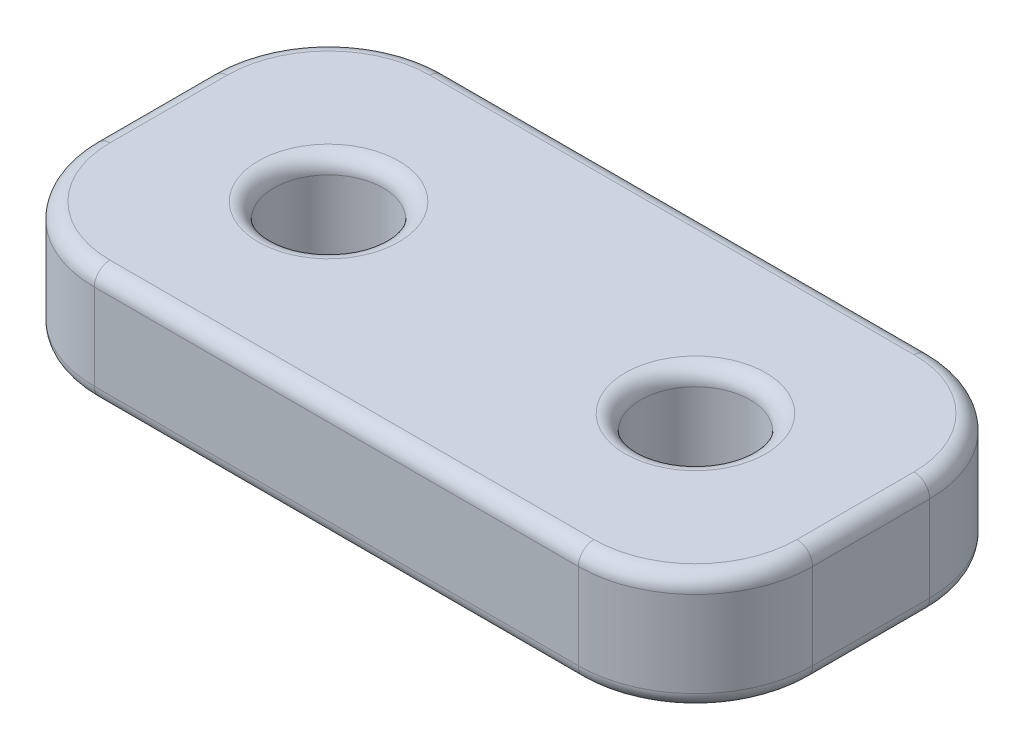
ISO-10303-21;
HEADER;
FILE_DESCRIPTION(('STEP AP214'),'2;1');
FILE_NAME('part.step','',(''),(''),'','','');
FILE_SCHEMA(('AUTOMOTIVE_DESIGN { 1 0 10303 214 1 1 1 1 }'));
ENDSEC;
DATA;
#1=APPLICATION_CONTEXT('core data for automotive mechanical design processes');
#2=APPLICATION_PROTOCOL_DEFINITION('international standard','automotive_design',2000,#1);
#3=PRODUCT_CONTEXT('',#1,'mechanical');
#4=PRODUCT('Part','Part','',(#3));
#5=PRODUCT_RELATED_PRODUCT_CATEGORY('part','',(#4));
#6=PRODUCT_DEFINITION_FORMATION('','',#4);
#7=PRODUCT_DEFINITION_CONTEXT('part definition',#1,'design');
#8=PRODUCT_DEFINITION('design','',#6,#7);
#9=PRODUCT_DEFINITION_SHAPE('','',#8);
#10=(LENGTH_UNIT() NAMED_UNIT(*) SI_UNIT(.MILLI.,.METRE.));
#11=(NAMED_UNIT(*) PLANE_ANGLE_UNIT() SI_UNIT($,.RADIAN.));
#12=(NAMED_UNIT(*) SI_UNIT($,.STERADIAN.) SOLID_ANGLE_UNIT());
#13=UNCERTAINTY_MEASURE_WITH_UNIT(LENGTH_MEASURE(1.E-05),#10,'distance_accuracy_value','');
#14=(GEOMETRIC_REPRESENTATION_CONTEXT(3) GLOBAL_UNCERTAINTY_ASSIGNED_CONTEXT((#13)) GLOBAL_UNIT_ASSIGNED_CONTEXT((#10,
#11,#12)) REPRESENTATION_CONTEXT('',''));
#15=CARTESIAN_POINT('',(0.,0.,0.));
#16=DIRECTION('',(0.,0.,1.));
#17=DIRECTION('',(1.,0.,0.));
#18=AXIS2_PLACEMENT_3D('',#15,#16,#17);
#19=CARTESIAN_POINT('',(0.,3.,0.));
#20=DIRECTION('',(0.,1.,0.));
#21=DIRECTION('',(0.,0.,1.));
#22=AXIS2_PLACEMENT_3D('',#19,#20,#21);
#23=PLANE('',#22);
#24=CARTESIAN_POINT('',(13.9,3.,4.5));
#25=DIRECTION('',(0.,1.,0.));
#26=DIRECTION('',(0.,0.,1.));
#27=AXIS2_PLACEMENT_3D('',#24,#25,#26);
#28=CIRCLE('',#27,1.8);
#29=CARTESIAN_POINT('',(13.9,3.,6.3));
#30=VERTEX_POINT('',#29);
#31=EDGE_CURVE('E11',#30,#30,#28,.F.);
#32=ORIENTED_EDGE('',*,*,#31,.T.);
#33=EDGE_LOOP('',(#32));
#34=FACE_BOUND('',#33,.T.);
#35=DIRECTION('',(1.,0.,0.));
#36=VECTOR('',#35,1.);
#37=CARTESIAN_POINT('',(15.4,3.,8.6));
#38=LINE('',#37,#36);
#39=CARTESIAN_POINT('',(3.,3.,8.6));
#40=VERTEX_POINT('',#39);
#41=CARTESIAN_POINT('',(15.4,3.,8.6));
#42=VERTEX_POINT('',#41);
#43=EDGE_CURVE('E50',#40,#42,#38,.T.);
#44=ORIENTED_EDGE('',*,*,#43,.T.);
#45=CARTESIAN_POINT('',(15.4,3.,6.));
#46=DIRECTION('',(0.,1.,0.));
#47=DIRECTION('',(0.,0.,1.));
#48=AXIS2_PLACEMENT_3D('',#45,#46,#47);
#49=CIRCLE('',#48,2.6);
#50=CARTESIAN_POINT('',(18.,3.,6.));
#51=VERTEX_POINT('',#50);
#52=EDGE_CURVE('E42',#42,#51,#49,.T.);
#53=ORIENTED_EDGE('',*,*,#52,.T.);
#54=DIRECTION('',(0.,0.,-1.));
#55=VECTOR('',#54,1.);
#56=CARTESIAN_POINT('',(18.,3.,3.));
#57=LINE('',#56,#55);
#58=CARTESIAN_POINT('',(18.,3.,3.));
#59=VERTEX_POINT('',#58);
#60=EDGE_CURVE('E232',#51,#59,#57,.T.);
#61=ORIENTED_EDGE('',*,*,#60,.T.);
#62=CARTESIAN_POINT('',(15.4,3.,3.));
#63=DIRECTION('',(0.,1.,0.));
#64=DIRECTION('',(0.,0.,1.));
#65=AXIS2_PLACEMENT_3D('',#62,#63,#64);
#66=CIRCLE('',#65,2.6);
#67=CARTESIAN_POINT('',(15.4,3.,0.4));
#68=VERTEX_POINT('',#67);
#69=EDGE_CURVE('E234',#59,#68,#66,.T.);
#70=ORIENTED_EDGE('',*,*,#69,.T.);
#71=DIRECTION('',(-1.,0.,0.));
#72=VECTOR('',#71,1.);
#73=CARTESIAN_POINT('',(3.,3.,0.4));
#74=LINE('',#73,#72);
#75=CARTESIAN_POINT('',(3.,3.,0.4));
#76=VERTEX_POINT('',#75);
#77=EDGE_CURVE('E236',#68,#76,#74,.T.);
#78=ORIENTED_EDGE('',*,*,#77,.T.);
#79=CARTESIAN_POINT('',(3.,3.,3.));
#80=DIRECTION('',(0.,1.,0.));
#81=DIRECTION('',(0.,0.,1.));
#82=AXIS2_PLACEMENT_3D('',#79,#80,#81);
#83=CIRCLE('',#82,2.6);
#84=CARTESIAN_POINT('',(0.4,3.,3.));
#85=VERTEX_POINT('',#84);
#86=EDGE_CURVE('E238',#76,#85,#83,.T.);
#87=ORIENTED_EDGE('',*,*,#86,.T.);
#88=DIRECTION('',(0.,0.,1.));
#89=VECTOR('',#88,1.);
#90=CARTESIAN_POINT('',(0.4,3.,6.));
#91=LINE('',#90,#89);
#92=CARTESIAN_POINT('',(0.4,3.,6.));
#93=VERTEX_POINT('',#92);
#94=EDGE_CURVE('E240',#85,#93,#91,.T.);
#95=ORIENTED_EDGE('',*,*,#94,.T.);
#96=CARTESIAN_POINT('',(3.,3.,6.));
#97=DIRECTION('',(0.,1.,0.));
#98=DIRECTION('',(0.,0.,1.));
#99=AXIS2_PLACEMENT_3D('',#96,#97,#98);
#100=CIRCLE('',#99,2.6);
#101=EDGE_CURVE('E55',#93,#40,#100,.T.);
#102=ORIENTED_EDGE('',*,*,#101,.T.);
#103=EDGE_LOOP('',(#44,#53,#61,#70,#78,#87,#95,#102));
#104=FACE_BOUND('',#103,.T.);
#105=CARTESIAN_POINT('',(4.5,3.,4.5));
#106=DIRECTION('',(0.,1.,0.));
#107=DIRECTION('',(0.,0.,1.));
#108=AXIS2_PLACEMENT_3D('',#105,#106,#107);
#109=CIRCLE('',#108,1.8);
#110=CARTESIAN_POINT('',(4.5,3.,6.3));
#111=VERTEX_POINT('',#110);
#112=EDGE_CURVE('E229',#111,#111,#109,.F.);
#113=ORIENTED_EDGE('',*,*,#112,.T.);
#114=EDGE_LOOP('',(#113));
#115=FACE_BOUND('',#114,.T.);
#116=ADVANCED_FACE('F33',(#34,#104,#115),#23,.T.);
#117=CARTESIAN_POINT('',(0.,0.,0.));
#118=DIRECTION('',(0.,1.,0.));
#119=DIRECTION('',(0.,0.,1.));
#120=AXIS2_PLACEMENT_3D('',#117,#118,#119);
#121=PLANE('',#120);
#122=CARTESIAN_POINT('',(13.9,0.,4.5));
#123=DIRECTION('',(0.,1.,0.));
#124=DIRECTION('',(0.,0.,1.));
#125=AXIS2_PLACEMENT_3D('',#122,#123,#124);
#126=CIRCLE('',#125,1.8);
#127=CARTESIAN_POINT('',(13.9,0.,6.3));
#128=VERTEX_POINT('',#127);
#129=EDGE_CURVE('E177',#128,#128,#126,.T.);
#130=ORIENTED_EDGE('',*,*,#129,.T.);
#131=EDGE_LOOP('',(#130));
#132=FACE_BOUND('',#131,.T.);
#133=CARTESIAN_POINT('',(4.5,0.,4.5));
#134=DIRECTION('',(0.,1.,0.));
#135=DIRECTION('',(0.,0.,1.));
#136=AXIS2_PLACEMENT_3D('',#133,#134,#135);
#137=CIRCLE('',#136,1.8);
#138=CARTESIAN_POINT('',(4.5,0.,6.3));
#139=VERTEX_POINT('',#138);
#140=EDGE_CURVE('E174',#139,#139,#137,.T.);
#141=ORIENTED_EDGE('',*,*,#140,.T.);
#142=EDGE_LOOP('',(#141));
#143=FACE_BOUND('',#142,.T.);
#144=DIRECTION('',(0.,0.,1.));
#145=VECTOR('',#144,1.);
#146=CARTESIAN_POINT('',(0.4,0.,0.));
#147=LINE('',#146,#145);
#148=CARTESIAN_POINT('',(0.4,0.,6.));
#149=VERTEX_POINT('',#148);
#150=CARTESIAN_POINT('',(0.4,0.,3.));
#151=VERTEX_POINT('',#150);
#152=EDGE_CURVE('E172',#149,#151,#147,.F.);
#153=ORIENTED_EDGE('',*,*,#152,.T.);
#154=CARTESIAN_POINT('',(3.,0.,3.));
#155=DIRECTION('',(0.,1.,0.));
#156=DIRECTION('',(0.,0.,1.));
#157=AXIS2_PLACEMENT_3D('',#154,#155,#156);
#158=CIRCLE('',#157,2.6);
#159=CARTESIAN_POINT('',(3.,0.,0.4));
#160=VERTEX_POINT('',#159);
#161=EDGE_CURVE('E153',#151,#160,#158,.F.);
#162=ORIENTED_EDGE('',*,*,#161,.T.);
#163=DIRECTION('',(-1.,0.,0.));
#164=VECTOR('',#163,1.);
#165=CARTESIAN_POINT('',(0.,0.,0.4));
#166=LINE('',#165,#164);
#167=CARTESIAN_POINT('',(15.4,0.,0.4));
#168=VERTEX_POINT('',#167);
#169=EDGE_CURVE('E161',#160,#168,#166,.F.);
#170=ORIENTED_EDGE('',*,*,#169,.T.);
#171=CARTESIAN_POINT('',(15.4,0.,3.));
#172=DIRECTION('',(0.,1.,0.));
#173=DIRECTION('',(0.,0.,1.));
#174=AXIS2_PLACEMENT_3D('',#171,#172,#173);
#175=CIRCLE('',#174,2.6);
#176=CARTESIAN_POINT('',(18.,0.,3.));
#177=VERTEX_POINT('',#176);
#178=EDGE_CURVE('E167',#168,#177,#175,.F.);
#179=ORIENTED_EDGE('',*,*,#178,.T.);
#180=DIRECTION('',(0.,0.,-1.));
#181=VECTOR('',#180,1.);
#182=CARTESIAN_POINT('',(18.,0.,0.));
#183=LINE('',#182,#181);
#184=CARTESIAN_POINT('',(18.,0.,6.));
#185=VERTEX_POINT('',#184);
#186=EDGE_CURVE('E326',#177,#185,#183,.F.);
#187=ORIENTED_EDGE('',*,*,#186,.T.);
#188=CARTESIAN_POINT('',(15.4,0.,6.));
#189=DIRECTION('',(0.,1.,0.));
#190=DIRECTION('',(0.,0.,1.));
#191=AXIS2_PLACEMENT_3D('',#188,#189,#190);
#192=CIRCLE('',#191,2.6);
#193=CARTESIAN_POINT('',(15.4,0.,8.6));
#194=VERTEX_POINT('',#193);
#195=EDGE_CURVE('E328',#185,#194,#192,.F.);
#196=ORIENTED_EDGE('',*,*,#195,.T.);
#197=DIRECTION('',(1.,0.,0.));
#198=VECTOR('',#197,1.);
#199=CARTESIAN_POINT('',(0.,0.,8.6));
#200=LINE('',#199,#198);
#201=CARTESIAN_POINT('',(3.,0.,8.6));
#202=VERTEX_POINT('',#201);
#203=EDGE_CURVE('E330',#194,#202,#200,.F.);
#204=ORIENTED_EDGE('',*,*,#203,.T.);
#205=CARTESIAN_POINT('',(3.,0.,6.));
#206=DIRECTION('',(0.,1.,0.));
#207=DIRECTION('',(0.,0.,1.));
#208=AXIS2_PLACEMENT_3D('',#205,#206,#207);
#209=CIRCLE('',#208,2.6);
#210=EDGE_CURVE('E179',#202,#149,#209,.F.);
#211=ORIENTED_EDGE('',*,*,#210,.T.);
#212=EDGE_LOOP('',(#153,#162,#170,#179,#187,#196,#204,#211));
#213=FACE_BOUND('',#212,.T.);
#214=ADVANCED_FACE('F170',(#132,#143,#213),#121,.F.);
#215=CARTESIAN_POINT('',(0.,3.,0.));
#216=DIRECTION('',(1.,0.,0.));
#217=DIRECTION('',(0.,0.,-1.));
#218=AXIS2_PLACEMENT_3D('',#215,#216,#217);
#219=PLANE('',#218);
#220=DIRECTION('',(0.,-1.,0.));
#221=VECTOR('',#220,1.);
#222=CARTESIAN_POINT('',(0.,3.,3.));
#223=LINE('',#222,#221);
#224=CARTESIAN_POINT('',(0.,2.6,3.));
#225=VERTEX_POINT('',#224);
#226=CARTESIAN_POINT('',(0.,0.4,3.));
#227=VERTEX_POINT('',#226);
#228=EDGE_CURVE('E301',#225,#227,#223,.T.);
#229=ORIENTED_EDGE('',*,*,#228,.T.);
#230=DIRECTION('',(0.,0.,1.));
#231=VECTOR('',#230,1.);
#232=CARTESIAN_POINT('',(0.,0.4,0.));
#233=LINE('',#232,#231);
#234=CARTESIAN_POINT('',(0.,0.4,6.));
#235=VERTEX_POINT('',#234);
#236=EDGE_CURVE('E202',#227,#235,#233,.T.);
#237=ORIENTED_EDGE('',*,*,#236,.T.);
#238=DIRECTION('',(0.,-1.,0.));
#239=VECTOR('',#238,1.);
#240=CARTESIAN_POINT('',(0.,3.,6.));
#241=LINE('',#240,#239);
#242=CARTESIAN_POINT('',(0.,2.6,6.));
#243=VERTEX_POINT('',#242);
#244=EDGE_CURVE('E168',#235,#243,#241,.F.);
#245=ORIENTED_EDGE('',*,*,#244,.T.);
#246=DIRECTION('',(0.,0.,1.));
#247=VECTOR('',#246,1.);
#248=CARTESIAN_POINT('',(0.,2.6,3.));
#249=LINE('',#248,#247);
#250=EDGE_CURVE('E200',#243,#225,#249,.F.);
#251=ORIENTED_EDGE('',*,*,#250,.T.);
#252=EDGE_LOOP('',(#229,#237,#245,#251));
#253=FACE_BOUND('',#252,.T.);
#254=ADVANCED_FACE('F343',(#253),#219,.F.);
#255=CARTESIAN_POINT('',(0.,3.,9.));
#256=DIRECTION('',(0.,0.,-1.));
#257=DIRECTION('',(-1.,0.,0.));
#258=AXIS2_PLACEMENT_3D('',#255,#256,#257);
#259=PLANE('',#258);
#260=DIRECTION('',(0.,-1.,0.));
#261=VECTOR('',#260,1.);
#262=CARTESIAN_POINT('',(3.,3.,9.));
#263=LINE('',#262,#261);
#264=CARTESIAN_POINT('',(3.,2.6,9.));
#265=VERTEX_POINT('',#264);
#266=CARTESIAN_POINT('',(3.,0.4,9.));
#267=VERTEX_POINT('',#266);
#268=EDGE_CURVE('E316',#265,#267,#263,.T.);
#269=ORIENTED_EDGE('',*,*,#268,.T.);
#270=DIRECTION('',(1.,0.,0.));
#271=VECTOR('',#270,1.);
#272=CARTESIAN_POINT('',(0.,0.4,9.));
#273=LINE('',#272,#271);
#274=CARTESIAN_POINT('',(15.4,0.4,9.));
#275=VERTEX_POINT('',#274);
#276=EDGE_CURVE('E210',#267,#275,#273,.T.);
#277=ORIENTED_EDGE('',*,*,#276,.T.);
#278=DIRECTION('',(0.,-1.,0.));
#279=VECTOR('',#278,1.);
#280=CARTESIAN_POINT('',(15.4,3.,9.));
#281=LINE('',#280,#279);
#282=CARTESIAN_POINT('',(15.4,2.6,9.));
#283=VERTEX_POINT('',#282);
#284=EDGE_CURVE('E319',#275,#283,#281,.F.);
#285=ORIENTED_EDGE('',*,*,#284,.T.);
#286=DIRECTION('',(1.,0.,0.));
#287=VECTOR('',#286,1.);
#288=CARTESIAN_POINT('',(3.,2.6,9.));
#289=LINE('',#288,#287);
#290=EDGE_CURVE('E208',#283,#265,#289,.F.);
#291=ORIENTED_EDGE('',*,*,#290,.T.);
#292=EDGE_LOOP('',(#269,#277,#285,#291));
#293=FACE_BOUND('',#292,.T.);
#294=ADVANCED_FACE('F387',(#293),#259,.F.);
#295=CARTESIAN_POINT('',(18.4,3.,0.));
#296=DIRECTION('',(-1.,0.,0.));
#297=DIRECTION('',(0.,0.,1.));
#298=AXIS2_PLACEMENT_3D('',#295,#296,#297);
#299=PLANE('',#298);
#300=DIRECTION('',(0.,-1.,0.));
#301=VECTOR('',#300,1.);
#302=CARTESIAN_POINT('',(18.4,3.,6.));
#303=LINE('',#302,#301);
#304=CARTESIAN_POINT('',(18.4,2.6,6.));
#305=VERTEX_POINT('',#304);
#306=CARTESIAN_POINT('',(18.4,0.4,6.));
#307=VERTEX_POINT('',#306);
#308=EDGE_CURVE('E308',#305,#307,#303,.T.);
#309=ORIENTED_EDGE('',*,*,#308,.T.);
#310=DIRECTION('',(0.,0.,-1.));
#311=VECTOR('',#310,1.);
#312=CARTESIAN_POINT('',(18.4,0.4,0.));
#313=LINE('',#312,#311);
#314=CARTESIAN_POINT('',(18.4,0.4,3.));
#315=VERTEX_POINT('',#314);
#316=EDGE_CURVE('E219',#307,#315,#313,.T.);
#317=ORIENTED_EDGE('',*,*,#316,.T.);
#318=DIRECTION('',(0.,-1.,0.));
#319=VECTOR('',#318,1.);
#320=CARTESIAN_POINT('',(18.4,3.,3.));
#321=LINE('',#320,#319);
#322=CARTESIAN_POINT('',(18.4,2.6,3.));
#323=VERTEX_POINT('',#322);
#324=EDGE_CURVE('E313',#315,#323,#321,.F.);
#325=ORIENTED_EDGE('',*,*,#324,.T.);
#326=DIRECTION('',(0.,0.,-1.));
#327=VECTOR('',#326,1.);
#328=CARTESIAN_POINT('',(18.4,2.6,6.));
#329=LINE('',#328,#327);
#330=EDGE_CURVE('E217',#323,#305,#329,.F.);
#331=ORIENTED_EDGE('',*,*,#330,.T.);
#332=EDGE_LOOP('',(#309,#317,#325,#331));
#333=FACE_BOUND('',#332,.T.);
#334=ADVANCED_FACE('F371',(#333),#299,.F.);
#335=CARTESIAN_POINT('',(0.,3.,0.));
#336=DIRECTION('',(0.,0.,1.));
#337=DIRECTION('',(1.,0.,0.));
#338=AXIS2_PLACEMENT_3D('',#335,#336,#337);
#339=PLANE('',#338);
#340=DIRECTION('',(0.,-1.,0.));
#341=VECTOR('',#340,1.);
#342=CARTESIAN_POINT('',(15.4,3.,0.));
#343=LINE('',#342,#341);
#344=CARTESIAN_POINT('',(15.4,2.6,0.));
#345=VERTEX_POINT('',#344);
#346=CARTESIAN_POINT('',(15.4,0.4,0.));
#347=VERTEX_POINT('',#346);
#348=EDGE_CURVE('E306',#345,#347,#343,.T.);
#349=ORIENTED_EDGE('',*,*,#348,.T.);
#350=DIRECTION('',(-1.,0.,0.));
#351=VECTOR('',#350,1.);
#352=CARTESIAN_POINT('',(0.,0.4,0.));
#353=LINE('',#352,#351);
#354=CARTESIAN_POINT('',(3.,0.4,0.));
#355=VERTEX_POINT('',#354);
#356=EDGE_CURVE('E227',#347,#355,#353,.T.);
#357=ORIENTED_EDGE('',*,*,#356,.T.);
#358=DIRECTION('',(0.,-1.,0.));
#359=VECTOR('',#358,1.);
#360=CARTESIAN_POINT('',(3.,3.,0.));
#361=LINE('',#360,#359);
#362=CARTESIAN_POINT('',(3.,2.6,0.));
#363=VERTEX_POINT('',#362);
#364=EDGE_CURVE('E262',#355,#363,#361,.F.);
#365=ORIENTED_EDGE('',*,*,#364,.T.);
#366=DIRECTION('',(-1.,0.,0.));
#367=VECTOR('',#366,1.);
#368=CARTESIAN_POINT('',(15.4,2.6,0.));
#369=LINE('',#368,#367);
#370=EDGE_CURVE('E225',#363,#345,#369,.F.);
#371=ORIENTED_EDGE('',*,*,#370,.T.);
#372=EDGE_LOOP('',(#349,#357,#365,#371));
#373=FACE_BOUND('',#372,.T.);
#374=ADVANCED_FACE('F304',(#373),#339,.F.);
#375=CARTESIAN_POINT('',(4.5,3.,4.5));
#376=DIRECTION('',(0.,-1.,0.));
#377=DIRECTION('',(0.,0.,-1.));
#378=AXIS2_PLACEMENT_3D('',#375,#376,#377);
#379=CYLINDRICAL_SURFACE('',#378,1.4);
#380=CARTESIAN_POINT('',(4.5,0.4,4.5));
#381=DIRECTION('',(0.,1.,0.));
#382=DIRECTION('',(0.,0.,1.));
#383=AXIS2_PLACEMENT_3D('',#380,#381,#382);
#384=CIRCLE('',#383,1.4);
#385=CARTESIAN_POINT('',(4.5,0.4,5.9));
#386=VERTEX_POINT('',#385);
#387=EDGE_CURVE('E194',#386,#386,#384,.F.);
#388=ORIENTED_EDGE('',*,*,#387,.T.);
#389=EDGE_LOOP('',(#388));
#390=FACE_BOUND('',#389,.T.);
#391=CARTESIAN_POINT('',(4.5,2.6,4.5));
#392=DIRECTION('',(0.,1.,0.));
#393=DIRECTION('',(0.,0.,1.));
#394=AXIS2_PLACEMENT_3D('',#391,#392,#393);
#395=CIRCLE('',#394,1.4);
#396=CARTESIAN_POINT('',(4.5,2.6,5.9));
#397=VERTEX_POINT('',#396);
#398=EDGE_CURVE('E191',#397,#397,#395,.T.);
#399=ORIENTED_EDGE('',*,*,#398,.T.);
#400=EDGE_LOOP('',(#399));
#401=FACE_BOUND('',#400,.T.);
#402=ADVANCED_FACE('F405',(#390,#401),#379,.F.);
#403=CARTESIAN_POINT('',(13.9,3.,4.5));
#404=DIRECTION('',(0.,-1.,0.));
#405=DIRECTION('',(0.,0.,-1.));
#406=AXIS2_PLACEMENT_3D('',#403,#404,#405);
#407=CYLINDRICAL_SURFACE('',#406,1.4);
#408=CARTESIAN_POINT('',(13.9,0.4,4.5));
#409=DIRECTION('',(0.,1.,0.));
#410=DIRECTION('',(0.,0.,1.));
#411=AXIS2_PLACEMENT_3D('',#408,#409,#410);
#412=CIRCLE('',#411,1.4);
#413=CARTESIAN_POINT('',(13.9,0.4,5.9));
#414=VERTEX_POINT('',#413);
#415=EDGE_CURVE('E188',#414,#414,#412,.F.);
#416=ORIENTED_EDGE('',*,*,#415,.T.);
#417=EDGE_LOOP('',(#416));
#418=FACE_BOUND('',#417,.T.);
#419=CARTESIAN_POINT('',(13.9,2.6,4.5));
#420=DIRECTION('',(0.,1.,0.));
#421=DIRECTION('',(0.,0.,1.));
#422=AXIS2_PLACEMENT_3D('',#419,#420,#421);
#423=CIRCLE('',#422,1.4);
#424=CARTESIAN_POINT('',(13.9,2.6,5.9));
#425=VERTEX_POINT('',#424);
#426=EDGE_CURVE('E185',#425,#425,#423,.T.);
#427=ORIENTED_EDGE('',*,*,#426,.T.);
#428=EDGE_LOOP('',(#427));
#429=FACE_BOUND('',#428,.T.);
#430=ADVANCED_FACE('F412',(#418,#429),#407,.F.);
#431=CARTESIAN_POINT('',(15.4,3.,3.));
#432=DIRECTION('',(0.,-1.,0.));
#433=DIRECTION('',(0.,0.,-1.));
#434=AXIS2_PLACEMENT_3D('',#431,#432,#433);
#435=CYLINDRICAL_SURFACE('',#434,3.);
#436=ORIENTED_EDGE('',*,*,#324,.F.);
#437=CARTESIAN_POINT('',(15.4,0.4,3.));
#438=DIRECTION('',(0.,1.,0.));
#439=DIRECTION('',(0.,0.,1.));
#440=AXIS2_PLACEMENT_3D('',#437,#438,#439);
#441=CIRCLE('',#440,3.);
#442=EDGE_CURVE('E223',#315,#347,#441,.T.);
#443=ORIENTED_EDGE('',*,*,#442,.T.);
#444=ORIENTED_EDGE('',*,*,#348,.F.);
#445=CARTESIAN_POINT('',(15.4,2.6,3.));
#446=DIRECTION('',(0.,1.,0.));
#447=DIRECTION('',(0.,0.,1.));
#448=AXIS2_PLACEMENT_3D('',#445,#446,#447);
#449=CIRCLE('',#448,3.);
#450=EDGE_CURVE('E221',#345,#323,#449,.F.);
#451=ORIENTED_EDGE('',*,*,#450,.T.);
#452=EDGE_LOOP('',(#436,#443,#444,#451));
#453=FACE_BOUND('',#452,.T.);
#454=ADVANCED_FACE('F417',(#453),#435,.T.);
#455=CARTESIAN_POINT('',(15.4,3.,6.));
#456=DIRECTION('',(0.,-1.,0.));
#457=DIRECTION('',(0.,0.,-1.));
#458=AXIS2_PLACEMENT_3D('',#455,#456,#457);
#459=CYLINDRICAL_SURFACE('',#458,3.);
#460=ORIENTED_EDGE('',*,*,#284,.F.);
#461=CARTESIAN_POINT('',(15.4,0.4,6.));
#462=DIRECTION('',(0.,1.,0.));
#463=DIRECTION('',(0.,0.,1.));
#464=AXIS2_PLACEMENT_3D('',#461,#462,#463);
#465=CIRCLE('',#464,3.);
#466=EDGE_CURVE('E215',#275,#307,#465,.T.);
#467=ORIENTED_EDGE('',*,*,#466,.T.);
#468=ORIENTED_EDGE('',*,*,#308,.F.);
#469=CARTESIAN_POINT('',(15.4,2.6,6.));
#470=DIRECTION('',(0.,1.,0.));
#471=DIRECTION('',(0.,0.,1.));
#472=AXIS2_PLACEMENT_3D('',#469,#470,#471);
#473=CIRCLE('',#472,3.);
#474=EDGE_CURVE('E212',#305,#283,#473,.F.);
#475=ORIENTED_EDGE('',*,*,#474,.T.);
#476=EDGE_LOOP('',(#460,#467,#468,#475));
#477=FACE_BOUND('',#476,.T.);
#478=ADVANCED_FACE('F376',(#477),#459,.T.);
#479=CARTESIAN_POINT('',(3.,3.,6.));
#480=DIRECTION('',(0.,-1.,0.));
#481=DIRECTION('',(0.,0.,-1.));
#482=AXIS2_PLACEMENT_3D('',#479,#480,#481);
#483=CYLINDRICAL_SURFACE('',#482,3.);
#484=ORIENTED_EDGE('',*,*,#244,.F.);
#485=CARTESIAN_POINT('',(3.,0.4,6.));
#486=DIRECTION('',(0.,1.,0.));
#487=DIRECTION('',(0.,0.,1.));
#488=AXIS2_PLACEMENT_3D('',#485,#486,#487);
#489=CIRCLE('',#488,3.);
#490=EDGE_CURVE('E206',#235,#267,#489,.T.);
#491=ORIENTED_EDGE('',*,*,#490,.T.);
#492=ORIENTED_EDGE('',*,*,#268,.F.);
#493=CARTESIAN_POINT('',(3.,2.6,6.));
#494=DIRECTION('',(0.,1.,0.));
#495=DIRECTION('',(0.,0.,1.));
#496=AXIS2_PLACEMENT_3D('',#493,#494,#495);
#497=CIRCLE('',#496,3.);
#498=EDGE_CURVE('E204',#265,#243,#497,.F.);
#499=ORIENTED_EDGE('',*,*,#498,.T.);
#500=EDGE_LOOP('',(#484,#491,#492,#499));
#501=FACE_BOUND('',#500,.T.);
#502=ADVANCED_FACE('F345',(#501),#483,.T.);
#503=CARTESIAN_POINT('',(3.,3.,3.));
#504=DIRECTION('',(0.,-1.,0.));
#505=DIRECTION('',(0.,0.,-1.));
#506=AXIS2_PLACEMENT_3D('',#503,#504,#505);
#507=CYLINDRICAL_SURFACE('',#506,3.);
#508=ORIENTED_EDGE('',*,*,#364,.F.);
#509=CARTESIAN_POINT('',(3.,0.4,3.));
#510=DIRECTION('',(0.,1.,0.));
#511=DIRECTION('',(0.,0.,1.));
#512=AXIS2_PLACEMENT_3D('',#509,#510,#511);
#513=CIRCLE('',#512,3.);
#514=EDGE_CURVE('E155',#355,#227,#513,.T.);
#515=ORIENTED_EDGE('',*,*,#514,.T.);
#516=ORIENTED_EDGE('',*,*,#228,.F.);
#517=CARTESIAN_POINT('',(3.,2.6,3.));
#518=DIRECTION('',(0.,1.,0.));
#519=DIRECTION('',(0.,0.,1.));
#520=AXIS2_PLACEMENT_3D('',#517,#518,#519);
#521=CIRCLE('',#520,3.);
#522=EDGE_CURVE('E197',#225,#363,#521,.F.);
#523=ORIENTED_EDGE('',*,*,#522,.T.);
#524=EDGE_LOOP('',(#508,#515,#516,#523));
#525=FACE_BOUND('',#524,.T.);
#526=ADVANCED_FACE('F299',(#525),#507,.T.);
#527=CARTESIAN_POINT('',(13.9,0.4,4.5));
#528=DIRECTION('',(0.,1.,0.));
#529=DIRECTION('',(0.,0.,1.));
#530=AXIS2_PLACEMENT_3D('',#527,#528,#529);
#531=TOROIDAL_SURFACE('',#530,1.8,0.4);
#532=ORIENTED_EDGE('',*,*,#415,.F.);
#533=EDGE_LOOP('',(#532));
#534=FACE_BOUND('',#533,.T.);
#535=ORIENTED_EDGE('',*,*,#129,.F.);
#536=EDGE_LOOP('',(#535));
#537=FACE_BOUND('',#536,.T.);
#538=ADVANCED_FACE('F486',(#534,#537),#531,.T.);
#539=CARTESIAN_POINT('',(4.5,0.4,4.5));
#540=DIRECTION('',(0.,1.,0.));
#541=DIRECTION('',(0.,0.,1.));
#542=AXIS2_PLACEMENT_3D('',#539,#540,#541);
#543=TOROIDAL_SURFACE('',#542,1.8,0.4);
#544=ORIENTED_EDGE('',*,*,#387,.F.);
#545=EDGE_LOOP('',(#544));
#546=FACE_BOUND('',#545,.T.);
#547=ORIENTED_EDGE('',*,*,#140,.F.);
#548=EDGE_LOOP('',(#547));
#549=FACE_BOUND('',#548,.T.);
#550=ADVANCED_FACE('F466',(#546,#549),#543,.T.);
#551=CARTESIAN_POINT('',(15.4,0.4,6.));
#552=DIRECTION('',(0.,1.,0.));
#553=DIRECTION('',(0.,0.,1.));
#554=AXIS2_PLACEMENT_3D('',#551,#552,#553);
#555=TOROIDAL_SURFACE('',#554,2.6,0.4);
#556=CARTESIAN_POINT('',(18.,0.4,6.));
#557=DIRECTION('',(0.,0.,-1.));
#558=DIRECTION('',(-1.,0.,0.));
#559=AXIS2_PLACEMENT_3D('',#556,#557,#558);
#560=CIRCLE('',#559,0.4);
#561=EDGE_CURVE('E256',#307,#185,#560,.T.);
#562=ORIENTED_EDGE('',*,*,#561,.F.);
#563=ORIENTED_EDGE('',*,*,#466,.F.);
#564=CARTESIAN_POINT('',(15.4,0.4,8.6));
#565=DIRECTION('',(-1.,0.,0.));
#566=DIRECTION('',(0.,0.,1.));
#567=AXIS2_PLACEMENT_3D('',#564,#565,#566);
#568=CIRCLE('',#567,0.4);
#569=EDGE_CURVE('E259',#194,#275,#568,.T.);
#570=ORIENTED_EDGE('',*,*,#569,.F.);
#571=ORIENTED_EDGE('',*,*,#195,.F.);
#572=EDGE_LOOP('',(#562,#563,#570,#571));
#573=FACE_BOUND('',#572,.T.);
#574=ADVANCED_FACE('F380',(#573),#555,.T.);
#575=CARTESIAN_POINT('',(0.,0.4,8.6));
#576=DIRECTION('',(1.,0.,0.));
#577=DIRECTION('',(0.,0.,-1.));
#578=AXIS2_PLACEMENT_3D('',#575,#576,#577);
#579=CYLINDRICAL_SURFACE('',#578,0.4);
#580=ORIENTED_EDGE('',*,*,#569,.T.);
#581=ORIENTED_EDGE('',*,*,#276,.F.);
#582=CARTESIAN_POINT('',(3.,0.4,8.6));
#583=DIRECTION('',(-1.,0.,0.));
#584=DIRECTION('',(0.,0.,1.));
#585=AXIS2_PLACEMENT_3D('',#582,#583,#584);
#586=CIRCLE('',#585,0.4);
#587=EDGE_CURVE('E253',#202,#267,#586,.T.);
#588=ORIENTED_EDGE('',*,*,#587,.F.);
#589=ORIENTED_EDGE('',*,*,#203,.F.);
#590=EDGE_LOOP('',(#580,#581,#588,#589));
#591=FACE_BOUND('',#590,.T.);
#592=ADVANCED_FACE('F385',(#591),#579,.T.);
#593=CARTESIAN_POINT('',(18.,0.4,0.));
#594=DIRECTION('',(0.,0.,-1.));
#595=DIRECTION('',(-1.,0.,0.));
#596=AXIS2_PLACEMENT_3D('',#593,#594,#595);
#597=CYLINDRICAL_SURFACE('',#596,0.4);
#598=ORIENTED_EDGE('',*,*,#561,.T.);
#599=ORIENTED_EDGE('',*,*,#186,.F.);
#600=CARTESIAN_POINT('',(18.,0.4,3.));
#601=DIRECTION('',(0.,0.,-1.));
#602=DIRECTION('',(-1.,0.,0.));
#603=AXIS2_PLACEMENT_3D('',#600,#601,#602);
#604=CIRCLE('',#603,0.4);
#605=EDGE_CURVE('E250',#315,#177,#604,.T.);
#606=ORIENTED_EDGE('',*,*,#605,.F.);
#607=ORIENTED_EDGE('',*,*,#316,.F.);
#608=EDGE_LOOP('',(#598,#599,#606,#607));
#609=FACE_BOUND('',#608,.T.);
#610=ADVANCED_FACE('F477',(#609),#597,.T.);
#611=CARTESIAN_POINT('',(3.,0.4,6.));
#612=DIRECTION('',(0.,1.,0.));
#613=DIRECTION('',(0.,0.,1.));
#614=AXIS2_PLACEMENT_3D('',#611,#612,#613);
#615=TOROIDAL_SURFACE('',#614,2.6,0.4);
#616=ORIENTED_EDGE('',*,*,#587,.T.);
#617=ORIENTED_EDGE('',*,*,#490,.F.);
#618=CARTESIAN_POINT('',(0.4,0.4,6.));
#619=DIRECTION('',(0.,0.,-1.));
#620=DIRECTION('',(-1.,0.,0.));
#621=AXIS2_PLACEMENT_3D('',#618,#619,#620);
#622=CIRCLE('',#621,0.4);
#623=EDGE_CURVE('E247',#149,#235,#622,.T.);
#624=ORIENTED_EDGE('',*,*,#623,.F.);
#625=ORIENTED_EDGE('',*,*,#210,.F.);
#626=EDGE_LOOP('',(#616,#617,#624,#625));
#627=FACE_BOUND('',#626,.T.);
#628=ADVANCED_FACE('F337',(#627),#615,.T.);
#629=CARTESIAN_POINT('',(15.4,0.4,3.));
#630=DIRECTION('',(0.,1.,0.));
#631=DIRECTION('',(0.,0.,1.));
#632=AXIS2_PLACEMENT_3D('',#629,#630,#631);
#633=TOROIDAL_SURFACE('',#632,2.6,0.4);
#634=ORIENTED_EDGE('',*,*,#605,.T.);
#635=ORIENTED_EDGE('',*,*,#178,.F.);
#636=CARTESIAN_POINT('',(15.4,0.4,0.4));
#637=DIRECTION('',(-1.,0.,0.));
#638=DIRECTION('',(0.,0.,1.));
#639=AXIS2_PLACEMENT_3D('',#636,#637,#638);
#640=CIRCLE('',#639,0.4);
#641=EDGE_CURVE('E164',#347,#168,#640,.T.);
#642=ORIENTED_EDGE('',*,*,#641,.F.);
#643=ORIENTED_EDGE('',*,*,#442,.F.);
#644=EDGE_LOOP('',(#634,#635,#642,#643));
#645=FACE_BOUND('',#644,.T.);
#646=ADVANCED_FACE('F471',(#645),#633,.T.);
#647=CARTESIAN_POINT('',(0.4,0.4,0.));
#648=DIRECTION('',(0.,0.,1.));
#649=DIRECTION('',(1.,0.,0.));
#650=AXIS2_PLACEMENT_3D('',#647,#648,#649);
#651=CYLINDRICAL_SURFACE('',#650,0.4);
#652=ORIENTED_EDGE('',*,*,#623,.T.);
#653=ORIENTED_EDGE('',*,*,#236,.F.);
#654=CARTESIAN_POINT('',(0.4,0.4,3.));
#655=DIRECTION('',(0.,0.,-1.));
#656=DIRECTION('',(-1.,0.,0.));
#657=AXIS2_PLACEMENT_3D('',#654,#655,#656);
#658=CIRCLE('',#657,0.4);
#659=EDGE_CURVE('E158',#151,#227,#658,.T.);
#660=ORIENTED_EDGE('',*,*,#659,.F.);
#661=ORIENTED_EDGE('',*,*,#152,.F.);
#662=EDGE_LOOP('',(#652,#653,#660,#661));
#663=FACE_BOUND('',#662,.T.);
#664=ADVANCED_FACE('F340',(#663),#651,.T.);
#665=CARTESIAN_POINT('',(0.,0.4,0.4));
#666=DIRECTION('',(-1.,0.,0.));
#667=DIRECTION('',(0.,0.,1.));
#668=AXIS2_PLACEMENT_3D('',#665,#666,#667);
#669=CYLINDRICAL_SURFACE('',#668,0.4);
#670=ORIENTED_EDGE('',*,*,#641,.T.);
#671=ORIENTED_EDGE('',*,*,#169,.F.);
#672=CARTESIAN_POINT('',(3.,0.4,0.4));
#673=DIRECTION('',(-1.,0.,0.));
#674=DIRECTION('',(0.,0.,1.));
#675=AXIS2_PLACEMENT_3D('',#672,#673,#674);
#676=CIRCLE('',#675,0.4);
#677=EDGE_CURVE('E149',#355,#160,#676,.T.);
#678=ORIENTED_EDGE('',*,*,#677,.F.);
#679=ORIENTED_EDGE('',*,*,#356,.F.);
#680=EDGE_LOOP('',(#670,#671,#678,#679));
#681=FACE_BOUND('',#680,.T.);
#682=ADVANCED_FACE('F162',(#681),#669,.T.);
#683=CARTESIAN_POINT('',(3.,0.4,3.));
#684=DIRECTION('',(0.,1.,0.));
#685=DIRECTION('',(0.,0.,1.));
#686=AXIS2_PLACEMENT_3D('',#683,#684,#685);
#687=TOROIDAL_SURFACE('',#686,2.6,0.4);
#688=ORIENTED_EDGE('',*,*,#659,.T.);
#689=ORIENTED_EDGE('',*,*,#514,.F.);
#690=ORIENTED_EDGE('',*,*,#677,.T.);
#691=ORIENTED_EDGE('',*,*,#161,.F.);
#692=EDGE_LOOP('',(#688,#689,#690,#691));
#693=FACE_BOUND('',#692,.T.);
#694=ADVANCED_FACE('F151',(#693),#687,.T.);
#695=CARTESIAN_POINT('',(13.9,2.6,4.5));
#696=DIRECTION('',(0.,1.,0.));
#697=DIRECTION('',(0.,0.,1.));
#698=AXIS2_PLACEMENT_3D('',#695,#696,#697);
#699=TOROIDAL_SURFACE('',#698,1.8,0.4);
#700=ORIENTED_EDGE('',*,*,#31,.F.);
#701=EDGE_LOOP('',(#700));
#702=FACE_BOUND('',#701,.T.);
#703=ORIENTED_EDGE('',*,*,#426,.F.);
#704=EDGE_LOOP('',(#703));
#705=FACE_BOUND('',#704,.T.);
#706=ADVANCED_FACE('F435',(#702,#705),#699,.T.);
#707=CARTESIAN_POINT('',(3.,2.6,3.));
#708=DIRECTION('',(0.,1.,0.));
#709=DIRECTION('',(0.,0.,1.));
#710=AXIS2_PLACEMENT_3D('',#707,#708,#709);
#711=TOROIDAL_SURFACE('',#710,2.6,0.4);
#712=CARTESIAN_POINT('',(3.,2.6,0.4));
#713=DIRECTION('',(1.,0.,0.));
#714=DIRECTION('',(0.,0.,-1.));
#715=AXIS2_PLACEMENT_3D('',#712,#713,#714);
#716=CIRCLE('',#715,0.4);
#717=EDGE_CURVE('E278',#363,#76,#716,.T.);
#718=ORIENTED_EDGE('',*,*,#717,.F.);
#719=ORIENTED_EDGE('',*,*,#522,.F.);
#720=CARTESIAN_POINT('',(0.4,2.6,3.));
#721=DIRECTION('',(0.,0.,1.));
#722=DIRECTION('',(1.,0.,0.));
#723=AXIS2_PLACEMENT_3D('',#720,#721,#722);
#724=CIRCLE('',#723,0.4);
#725=EDGE_CURVE('E37',#85,#225,#724,.T.);
#726=ORIENTED_EDGE('',*,*,#725,.F.);
#727=ORIENTED_EDGE('',*,*,#86,.F.);
#728=EDGE_LOOP('',(#718,#719,#726,#727));
#729=FACE_BOUND('',#728,.T.);
#730=ADVANCED_FACE('F294',(#729),#711,.T.);
#731=CARTESIAN_POINT('',(0.4,2.6,0.));
#732=DIRECTION('',(0.,0.,-1.));
#733=DIRECTION('',(-1.,0.,0.));
#734=AXIS2_PLACEMENT_3D('',#731,#732,#733);
#735=CYLINDRICAL_SURFACE('',#734,0.4);
#736=ORIENTED_EDGE('',*,*,#725,.T.);
#737=ORIENTED_EDGE('',*,*,#250,.F.);
#738=CARTESIAN_POINT('',(0.4,2.6,6.));
#739=DIRECTION('',(0.,0.,1.));
#740=DIRECTION('',(1.,0.,0.));
#741=AXIS2_PLACEMENT_3D('',#738,#739,#740);
#742=CIRCLE('',#741,0.4);
#743=EDGE_CURVE('E276',#93,#243,#742,.T.);
#744=ORIENTED_EDGE('',*,*,#743,.F.);
#745=ORIENTED_EDGE('',*,*,#94,.F.);
#746=EDGE_LOOP('',(#736,#737,#744,#745));
#747=FACE_BOUND('',#746,.T.);
#748=ADVANCED_FACE('F289',(#747),#735,.T.);
#749=CARTESIAN_POINT('',(0.,2.6,0.4));
#750=DIRECTION('',(1.,0.,0.));
#751=DIRECTION('',(0.,0.,-1.));
#752=AXIS2_PLACEMENT_3D('',#749,#750,#751);
#753=CYLINDRICAL_SURFACE('',#752,0.4);
#754=ORIENTED_EDGE('',*,*,#717,.T.);
#755=ORIENTED_EDGE('',*,*,#77,.F.);
#756=CARTESIAN_POINT('',(15.4,2.6,0.4));
#757=DIRECTION('',(1.,0.,0.));
#758=DIRECTION('',(0.,0.,-1.));
#759=AXIS2_PLACEMENT_3D('',#756,#757,#758);
#760=CIRCLE('',#759,0.4);
#761=EDGE_CURVE('E273',#345,#68,#760,.T.);
#762=ORIENTED_EDGE('',*,*,#761,.F.);
#763=ORIENTED_EDGE('',*,*,#370,.F.);
#764=EDGE_LOOP('',(#754,#755,#762,#763));
#765=FACE_BOUND('',#764,.T.);
#766=ADVANCED_FACE('F444',(#765),#753,.T.);
#767=CARTESIAN_POINT('',(3.,2.6,6.));
#768=DIRECTION('',(0.,1.,0.));
#769=DIRECTION('',(0.,0.,1.));
#770=AXIS2_PLACEMENT_3D('',#767,#768,#769);
#771=TOROIDAL_SURFACE('',#770,2.6,0.4);
#772=ORIENTED_EDGE('',*,*,#743,.T.);
#773=ORIENTED_EDGE('',*,*,#498,.F.);
#774=CARTESIAN_POINT('',(3.,2.6,8.6));
#775=DIRECTION('',(1.,0.,0.));
#776=DIRECTION('',(0.,0.,-1.));
#777=AXIS2_PLACEMENT_3D('',#774,#775,#776);
#778=CIRCLE('',#777,0.4);
#779=EDGE_CURVE('E270',#40,#265,#778,.T.);
#780=ORIENTED_EDGE('',*,*,#779,.F.);
#781=ORIENTED_EDGE('',*,*,#101,.F.);
#782=EDGE_LOOP('',(#772,#773,#780,#781));
#783=FACE_BOUND('',#782,.T.);
#784=ADVANCED_FACE('F349',(#783),#771,.T.);
#785=CARTESIAN_POINT('',(15.4,2.6,3.));
#786=DIRECTION('',(0.,1.,0.));
#787=DIRECTION('',(0.,0.,1.));
#788=AXIS2_PLACEMENT_3D('',#785,#786,#787);
#789=TOROIDAL_SURFACE('',#788,2.6,0.4);
#790=ORIENTED_EDGE('',*,*,#761,.T.);
#791=ORIENTED_EDGE('',*,*,#69,.F.);
#792=CARTESIAN_POINT('',(18.,2.6,3.));
#793=DIRECTION('',(0.,0.,1.));
#794=DIRECTION('',(1.,0.,0.));
#795=AXIS2_PLACEMENT_3D('',#792,#793,#794);
#796=CIRCLE('',#795,0.4);
#797=EDGE_CURVE('E267',#323,#59,#796,.T.);
#798=ORIENTED_EDGE('',*,*,#797,.F.);
#799=ORIENTED_EDGE('',*,*,#450,.F.);
#800=EDGE_LOOP('',(#790,#791,#798,#799));
#801=FACE_BOUND('',#800,.T.);
#802=ADVANCED_FACE('F364',(#801),#789,.T.);
#803=CARTESIAN_POINT('',(0.,2.6,8.6));
#804=DIRECTION('',(-1.,0.,0.));
#805=DIRECTION('',(0.,0.,1.));
#806=AXIS2_PLACEMENT_3D('',#803,#804,#805);
#807=CYLINDRICAL_SURFACE('',#806,0.4);
#808=ORIENTED_EDGE('',*,*,#779,.T.);
#809=ORIENTED_EDGE('',*,*,#290,.F.);
#810=CARTESIAN_POINT('',(15.4,2.6,8.6));
#811=DIRECTION('',(1.,0.,0.));
#812=DIRECTION('',(0.,0.,-1.));
#813=AXIS2_PLACEMENT_3D('',#810,#811,#812);
#814=CIRCLE('',#813,0.4);
#815=EDGE_CURVE('E265',#42,#283,#814,.T.);
#816=ORIENTED_EDGE('',*,*,#815,.F.);
#817=ORIENTED_EDGE('',*,*,#43,.F.);
#818=EDGE_LOOP('',(#808,#809,#816,#817));
#819=FACE_BOUND('',#818,.T.);
#820=ADVANCED_FACE('F352',(#819),#807,.T.);
#821=CARTESIAN_POINT('',(18.,2.6,0.));
#822=DIRECTION('',(0.,0.,1.));
#823=DIRECTION('',(1.,0.,0.));
#824=AXIS2_PLACEMENT_3D('',#821,#822,#823);
#825=CYLINDRICAL_SURFACE('',#824,0.4);
#826=ORIENTED_EDGE('',*,*,#797,.T.);
#827=ORIENTED_EDGE('',*,*,#60,.F.);
#828=CARTESIAN_POINT('',(18.,2.6,6.));
#829=DIRECTION('',(0.,0.,1.));
#830=DIRECTION('',(1.,0.,0.));
#831=AXIS2_PLACEMENT_3D('',#828,#829,#830);
#832=CIRCLE('',#831,0.4);
#833=EDGE_CURVE('E263',#305,#51,#832,.T.);
#834=ORIENTED_EDGE('',*,*,#833,.F.);
#835=ORIENTED_EDGE('',*,*,#330,.F.);
#836=EDGE_LOOP('',(#826,#827,#834,#835));
#837=FACE_BOUND('',#836,.T.);
#838=ADVANCED_FACE('F368',(#837),#825,.T.);
#839=CARTESIAN_POINT('',(15.4,2.6,6.));
#840=DIRECTION('',(0.,1.,0.));
#841=DIRECTION('',(0.,0.,1.));
#842=AXIS2_PLACEMENT_3D('',#839,#840,#841);
#843=TOROIDAL_SURFACE('',#842,2.6,0.4);
#844=ORIENTED_EDGE('',*,*,#815,.T.);
#845=ORIENTED_EDGE('',*,*,#474,.F.);
#846=ORIENTED_EDGE('',*,*,#833,.T.);
#847=ORIENTED_EDGE('',*,*,#52,.F.);
#848=EDGE_LOOP('',(#844,#845,#846,#847));
#849=FACE_BOUND('',#848,.T.);
#850=ADVANCED_FACE('F356',(#849),#843,.T.);
#851=CARTESIAN_POINT('',(4.5,2.6,4.5));
#852=DIRECTION('',(0.,1.,0.));
#853=DIRECTION('',(0.,0.,1.));
#854=AXIS2_PLACEMENT_3D('',#851,#852,#853);
#855=TOROIDAL_SURFACE('',#854,1.8,0.4);
#856=ORIENTED_EDGE('',*,*,#112,.F.);
#857=EDGE_LOOP('',(#856));
#858=FACE_BOUND('',#857,.T.);
#859=ORIENTED_EDGE('',*,*,#398,.F.);
#860=EDGE_LOOP('',(#859));
#861=FACE_BOUND('',#860,.T.);
#862=ADVANCED_FACE('F35',(#858,#861),#855,.T.);
#863=CLOSED_SHELL('',(#116,#214,#254,#294,#334,#374,#402,#430,#454,#478,#502,#526,#538,#550,
#574,#592,#610,#628,#646,#664,#682,#694,#706,#730,#748,#766,#784,#802,#820,#838,#850,#862));
#864=MANIFOLD_SOLID_BREP('B2',#863);
#865=ADVANCED_BREP_SHAPE_REPRESENTATION('',(#18,#864),#14);
#866=SHAPE_DEFINITION_REPRESENTATION(#9,#865);
ENDSEC;
END-ISO-10303-21;
